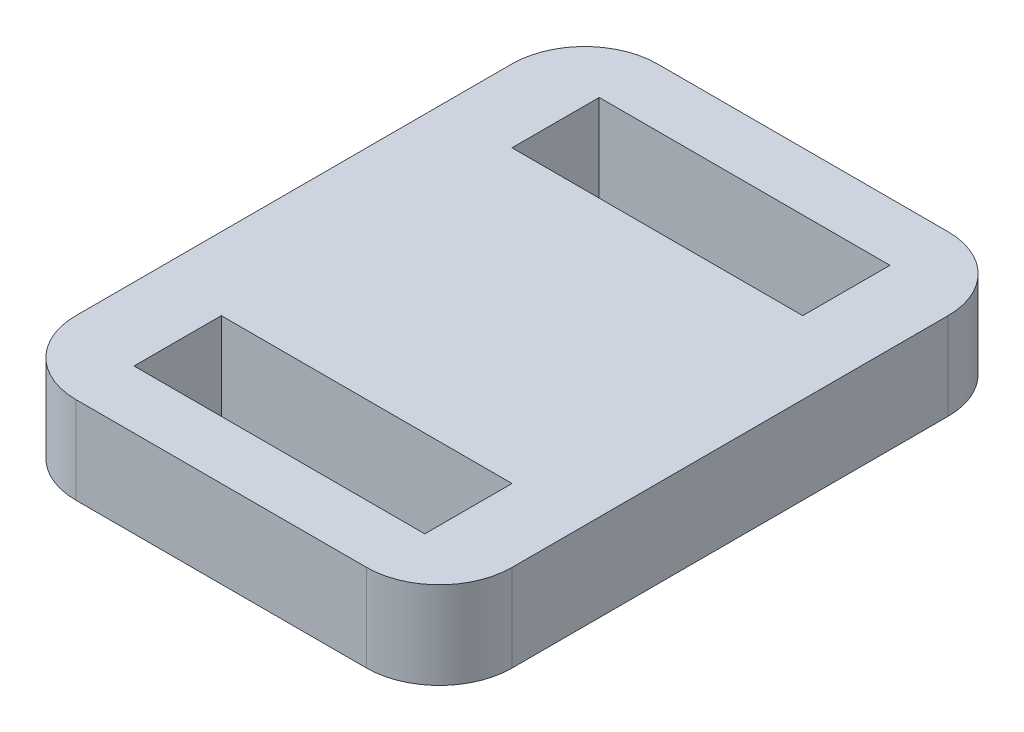
ISO-10303-21;
HEADER;
FILE_DESCRIPTION(('STEP AP214'),'2;1');
FILE_NAME('part.step','',(''),(''),'','','');
FILE_SCHEMA(('AUTOMOTIVE_DESIGN { 1 0 10303 214 1 1 1 1 }'));
ENDSEC;
DATA;
#1=APPLICATION_CONTEXT('core data for automotive mechanical design processes');
#2=APPLICATION_PROTOCOL_DEFINITION('international standard','automotive_design',2000,#1);
#3=PRODUCT_CONTEXT('',#1,'mechanical');
#4=PRODUCT('Part','Part','',(#3));
#5=PRODUCT_RELATED_PRODUCT_CATEGORY('part','',(#4));
#6=PRODUCT_DEFINITION_FORMATION('','',#4);
#7=PRODUCT_DEFINITION_CONTEXT('part definition',#1,'design');
#8=PRODUCT_DEFINITION('design','',#6,#7);
#9=PRODUCT_DEFINITION_SHAPE('','',#8);
#10=(LENGTH_UNIT() NAMED_UNIT(*) SI_UNIT(.MILLI.,.METRE.));
#11=(NAMED_UNIT(*) PLANE_ANGLE_UNIT() SI_UNIT($,.RADIAN.));
#12=(NAMED_UNIT(*) SI_UNIT($,.STERADIAN.) SOLID_ANGLE_UNIT());
#13=UNCERTAINTY_MEASURE_WITH_UNIT(LENGTH_MEASURE(1.E-05),#10,'distance_accuracy_value','');
#14=(GEOMETRIC_REPRESENTATION_CONTEXT(3) GLOBAL_UNCERTAINTY_ASSIGNED_CONTEXT((#13)) GLOBAL_UNIT_ASSIGNED_CONTEXT((#10,
#11,#12)) REPRESENTATION_CONTEXT('',''));
#15=CARTESIAN_POINT('',(0.,0.,0.));
#16=DIRECTION('',(0.,0.,1.));
#17=DIRECTION('',(1.,0.,0.));
#18=AXIS2_PLACEMENT_3D('',#15,#16,#17);
#19=CARTESIAN_POINT('',(10.,6.,2.));
#20=DIRECTION('',(0.,-1.,0.));
#21=DIRECTION('',(0.,0.,-1.));
#22=AXIS2_PLACEMENT_3D('',#19,#20,#21);
#23=PLANE('',#22);
#24=DIRECTION('',(0.,0.,-1.));
#25=VECTOR('',#24,1.);
#26=CARTESIAN_POINT('',(10.,6.,-3.));
#27=LINE('',#26,#25);
#28=CARTESIAN_POINT('',(10.,6.,3.));
#29=VERTEX_POINT('',#28);
#30=CARTESIAN_POINT('',(10.,6.,-3.));
#31=VERTEX_POINT('',#30);
#32=EDGE_CURVE('E182',#29,#31,#27,.T.);
#33=ORIENTED_EDGE('',*,*,#32,.F.);
#34=DIRECTION('',(1.,0.,0.));
#35=VECTOR('',#34,1.);
#36=CARTESIAN_POINT('',(-10.,6.,3.));
#37=LINE('',#36,#35);
#38=CARTESIAN_POINT('',(-10.,6.,3.));
#39=VERTEX_POINT('',#38);
#40=EDGE_CURVE('E190',#39,#29,#37,.T.);
#41=ORIENTED_EDGE('',*,*,#40,.F.);
#42=DIRECTION('',(0.,0.,1.));
#43=VECTOR('',#42,1.);
#44=CARTESIAN_POINT('',(-10.,6.,-3.));
#45=LINE('',#44,#43);
#46=CARTESIAN_POINT('',(-10.,6.,-3.));
#47=VERTEX_POINT('',#46);
#48=EDGE_CURVE('E187',#47,#39,#45,.T.);
#49=ORIENTED_EDGE('',*,*,#48,.F.);
#50=DIRECTION('',(-1.,0.,0.));
#51=VECTOR('',#50,1.);
#52=CARTESIAN_POINT('',(-10.,6.,-3.));
#53=LINE('',#52,#51);
#54=EDGE_CURVE('E184',#31,#47,#53,.T.);
#55=ORIENTED_EDGE('',*,*,#54,.F.);
#56=EDGE_LOOP('',(#33,#41,#49,#55));
#57=FACE_BOUND('',#56,.T.);
#58=CARTESIAN_POINT('',(10.,6.,2.));
#59=DIRECTION('',(0.,1.,0.));
#60=DIRECTION('',(0.,0.,-1.));
#61=AXIS2_PLACEMENT_3D('',#58,#59,#60);
#62=CIRCLE('',#61,5.);
#63=CARTESIAN_POINT('',(9.99999999999997,6.,7.));
#64=VERTEX_POINT('',#63);
#65=CARTESIAN_POINT('',(15.,6.,1.99999999999996));
#66=VERTEX_POINT('',#65);
#67=EDGE_CURVE('E213',#64,#66,#62,.T.);
#68=ORIENTED_EDGE('',*,*,#67,.T.);
#69=DIRECTION('',(0.,0.,-1.));
#70=VECTOR('',#69,1.);
#71=CARTESIAN_POINT('',(15.,6.,-28.));
#72=LINE('',#71,#70);
#73=CARTESIAN_POINT('',(15.,6.,-28.));
#74=VERTEX_POINT('',#73);
#75=EDGE_CURVE('E216',#66,#74,#72,.T.);
#76=ORIENTED_EDGE('',*,*,#75,.T.);
#77=CARTESIAN_POINT('',(10.,6.,-28.));
#78=DIRECTION('',(0.,1.,0.));
#79=DIRECTION('',(0.,0.,1.));
#80=AXIS2_PLACEMENT_3D('',#77,#78,#79);
#81=CIRCLE('',#80,5.);
#82=CARTESIAN_POINT('',(9.99999999999996,6.,-33.));
#83=VERTEX_POINT('',#82);
#84=EDGE_CURVE('E219',#74,#83,#81,.T.);
#85=ORIENTED_EDGE('',*,*,#84,.T.);
#86=DIRECTION('',(-1.,0.,0.));
#87=VECTOR('',#86,1.);
#88=CARTESIAN_POINT('',(-9.99999999999997,6.,-33.));
#89=LINE('',#88,#87);
#90=CARTESIAN_POINT('',(-9.99999999999997,6.,-33.));
#91=VERTEX_POINT('',#90);
#92=EDGE_CURVE('E221',#83,#91,#89,.T.);
#93=ORIENTED_EDGE('',*,*,#92,.T.);
#94=CARTESIAN_POINT('',(-10.,6.,-28.));
#95=DIRECTION('',(0.,1.,0.));
#96=DIRECTION('',(0.,0.,1.));
#97=AXIS2_PLACEMENT_3D('',#94,#95,#96);
#98=CIRCLE('',#97,5.);
#99=CARTESIAN_POINT('',(-15.,6.,-28.));
#100=VERTEX_POINT('',#99);
#101=EDGE_CURVE('E223',#91,#100,#98,.T.);
#102=ORIENTED_EDGE('',*,*,#101,.T.);
#103=DIRECTION('',(0.,0.,1.));
#104=VECTOR('',#103,1.);
#105=CARTESIAN_POINT('',(-15.,6.,-28.));
#106=LINE('',#105,#104);
#107=CARTESIAN_POINT('',(-15.,6.,1.99999999999996));
#108=VERTEX_POINT('',#107);
#109=EDGE_CURVE('E225',#100,#108,#106,.T.);
#110=ORIENTED_EDGE('',*,*,#109,.T.);
#111=CARTESIAN_POINT('',(-10.,6.,2.));
#112=DIRECTION('',(0.,1.,0.));
#113=DIRECTION('',(0.,0.,-1.));
#114=AXIS2_PLACEMENT_3D('',#111,#112,#113);
#115=CIRCLE('',#114,5.);
#116=CARTESIAN_POINT('',(-9.99999999999996,6.,7.));
#117=VERTEX_POINT('',#116);
#118=EDGE_CURVE('E227',#108,#117,#115,.T.);
#119=ORIENTED_EDGE('',*,*,#118,.T.);
#120=DIRECTION('',(1.,0.,0.));
#121=VECTOR('',#120,1.);
#122=CARTESIAN_POINT('',(-9.99999999999996,6.,7.));
#123=LINE('',#122,#121);
#124=EDGE_CURVE('E229',#117,#64,#123,.T.);
#125=ORIENTED_EDGE('',*,*,#124,.T.);
#126=EDGE_LOOP('',(#68,#76,#85,#93,#102,#110,#119,#125));
#127=FACE_BOUND('',#126,.T.);
#128=DIRECTION('',(0.,0.,-1.));
#129=VECTOR('',#128,1.);
#130=CARTESIAN_POINT('',(10.,6.,-29.));
#131=LINE('',#130,#129);
#132=CARTESIAN_POINT('',(10.,6.,-23.));
#133=VERTEX_POINT('',#132);
#134=CARTESIAN_POINT('',(10.,6.,-29.));
#135=VERTEX_POINT('',#134);
#136=EDGE_CURVE('E146',#133,#135,#131,.T.);
#137=ORIENTED_EDGE('',*,*,#136,.F.);
#138=DIRECTION('',(1.,0.,0.));
#139=VECTOR('',#138,1.);
#140=CARTESIAN_POINT('',(-10.,6.,-23.));
#141=LINE('',#140,#139);
#142=CARTESIAN_POINT('',(-9.99999999999999,6.,-23.));
#143=VERTEX_POINT('',#142);
#144=EDGE_CURVE('E168',#143,#133,#141,.T.);
#145=ORIENTED_EDGE('',*,*,#144,.F.);
#146=DIRECTION('',(0.,0.,1.));
#147=VECTOR('',#146,1.);
#148=CARTESIAN_POINT('',(-10.,6.,-29.));
#149=LINE('',#148,#147);
#150=CARTESIAN_POINT('',(-10.,6.,-29.));
#151=VERTEX_POINT('',#150);
#152=EDGE_CURVE('E166',#151,#143,#149,.T.);
#153=ORIENTED_EDGE('',*,*,#152,.F.);
#154=DIRECTION('',(-1.,0.,0.));
#155=VECTOR('',#154,1.);
#156=CARTESIAN_POINT('',(-10.,6.,-29.));
#157=LINE('',#156,#155);
#158=EDGE_CURVE('E154',#135,#151,#157,.T.);
#159=ORIENTED_EDGE('',*,*,#158,.F.);
#160=EDGE_LOOP('',(#137,#145,#153,#159));
#161=FACE_BOUND('',#160,.T.);
#162=ADVANCED_FACE('F33',(#57,#127,#161),#23,.F.);
#163=CARTESIAN_POINT('',(10.,0.,2.));
#164=DIRECTION('',(0.,-1.,0.));
#165=DIRECTION('',(0.,0.,-1.));
#166=AXIS2_PLACEMENT_3D('',#163,#164,#165);
#167=PLANE('',#166);
#168=CARTESIAN_POINT('',(10.,0.,2.));
#169=DIRECTION('',(0.,1.,0.));
#170=DIRECTION('',(0.,0.,-1.));
#171=AXIS2_PLACEMENT_3D('',#168,#169,#170);
#172=CIRCLE('',#171,5.);
#173=CARTESIAN_POINT('',(9.99999999999997,0.,7.));
#174=VERTEX_POINT('',#173);
#175=CARTESIAN_POINT('',(15.,0.,1.99999999999996));
#176=VERTEX_POINT('',#175);
#177=EDGE_CURVE('E212',#174,#176,#172,.T.);
#178=ORIENTED_EDGE('',*,*,#177,.F.);
#179=DIRECTION('',(1.,0.,0.));
#180=VECTOR('',#179,1.);
#181=CARTESIAN_POINT('',(-9.99999999999996,0.,7.));
#182=LINE('',#181,#180);
#183=CARTESIAN_POINT('',(-9.99999999999996,0.,7.));
#184=VERTEX_POINT('',#183);
#185=EDGE_CURVE('E217',#184,#174,#182,.T.);
#186=ORIENTED_EDGE('',*,*,#185,.F.);
#187=CARTESIAN_POINT('',(-10.,0.,2.));
#188=DIRECTION('',(0.,1.,0.));
#189=DIRECTION('',(0.,0.,-1.));
#190=AXIS2_PLACEMENT_3D('',#187,#188,#189);
#191=CIRCLE('',#190,5.);
#192=CARTESIAN_POINT('',(-15.,0.,1.99999999999996));
#193=VERTEX_POINT('',#192);
#194=EDGE_CURVE('E244',#193,#184,#191,.T.);
#195=ORIENTED_EDGE('',*,*,#194,.F.);
#196=DIRECTION('',(0.,0.,1.));
#197=VECTOR('',#196,1.);
#198=CARTESIAN_POINT('',(-15.,0.,-28.));
#199=LINE('',#198,#197);
#200=CARTESIAN_POINT('',(-15.,0.,-28.));
#201=VERTEX_POINT('',#200);
#202=EDGE_CURVE('E242',#201,#193,#199,.T.);
#203=ORIENTED_EDGE('',*,*,#202,.F.);
#204=CARTESIAN_POINT('',(-10.,0.,-28.));
#205=DIRECTION('',(0.,1.,0.));
#206=DIRECTION('',(0.,0.,1.));
#207=AXIS2_PLACEMENT_3D('',#204,#205,#206);
#208=CIRCLE('',#207,5.);
#209=CARTESIAN_POINT('',(-9.99999999999997,0.,-33.));
#210=VERTEX_POINT('',#209);
#211=EDGE_CURVE('E240',#210,#201,#208,.T.);
#212=ORIENTED_EDGE('',*,*,#211,.F.);
#213=DIRECTION('',(-1.,0.,0.));
#214=VECTOR('',#213,1.);
#215=CARTESIAN_POINT('',(-9.99999999999997,0.,-33.));
#216=LINE('',#215,#214);
#217=CARTESIAN_POINT('',(9.99999999999996,0.,-33.));
#218=VERTEX_POINT('',#217);
#219=EDGE_CURVE('E238',#218,#210,#216,.T.);
#220=ORIENTED_EDGE('',*,*,#219,.F.);
#221=CARTESIAN_POINT('',(10.,0.,-28.));
#222=DIRECTION('',(0.,1.,0.));
#223=DIRECTION('',(0.,0.,1.));
#224=AXIS2_PLACEMENT_3D('',#221,#222,#223);
#225=CIRCLE('',#224,5.);
#226=CARTESIAN_POINT('',(15.,0.,-28.));
#227=VERTEX_POINT('',#226);
#228=EDGE_CURVE('E236',#227,#218,#225,.T.);
#229=ORIENTED_EDGE('',*,*,#228,.F.);
#230=DIRECTION('',(0.,0.,-1.));
#231=VECTOR('',#230,1.);
#232=CARTESIAN_POINT('',(15.,0.,-28.));
#233=LINE('',#232,#231);
#234=EDGE_CURVE('E234',#176,#227,#233,.T.);
#235=ORIENTED_EDGE('',*,*,#234,.F.);
#236=EDGE_LOOP('',(#178,#186,#195,#203,#212,#220,#229,#235));
#237=FACE_BOUND('',#236,.T.);
#238=DIRECTION('',(1.,0.,0.));
#239=VECTOR('',#238,1.);
#240=CARTESIAN_POINT('',(-10.,0.,3.));
#241=LINE('',#240,#239);
#242=CARTESIAN_POINT('',(-10.,0.,3.));
#243=VERTEX_POINT('',#242);
#244=CARTESIAN_POINT('',(10.,0.,3.));
#245=VERTEX_POINT('',#244);
#246=EDGE_CURVE('E185',#243,#245,#241,.T.);
#247=ORIENTED_EDGE('',*,*,#246,.T.);
#248=DIRECTION('',(0.,0.,-1.));
#249=VECTOR('',#248,1.);
#250=CARTESIAN_POINT('',(10.,0.,-3.));
#251=LINE('',#250,#249);
#252=CARTESIAN_POINT('',(10.,0.,-3.));
#253=VERTEX_POINT('',#252);
#254=EDGE_CURVE('E162',#245,#253,#251,.T.);
#255=ORIENTED_EDGE('',*,*,#254,.T.);
#256=DIRECTION('',(-1.,0.,0.));
#257=VECTOR('',#256,1.);
#258=CARTESIAN_POINT('',(-10.,0.,-3.));
#259=LINE('',#258,#257);
#260=CARTESIAN_POINT('',(-10.,0.,-3.));
#261=VERTEX_POINT('',#260);
#262=EDGE_CURVE('E195',#253,#261,#259,.T.);
#263=ORIENTED_EDGE('',*,*,#262,.T.);
#264=DIRECTION('',(0.,0.,1.));
#265=VECTOR('',#264,1.);
#266=CARTESIAN_POINT('',(-10.,0.,-3.));
#267=LINE('',#266,#265);
#268=EDGE_CURVE('E198',#261,#243,#267,.T.);
#269=ORIENTED_EDGE('',*,*,#268,.T.);
#270=EDGE_LOOP('',(#247,#255,#263,#269));
#271=FACE_BOUND('',#270,.T.);
#272=DIRECTION('',(1.,0.,0.));
#273=VECTOR('',#272,1.);
#274=CARTESIAN_POINT('',(-10.,0.,-23.));
#275=LINE('',#274,#273);
#276=CARTESIAN_POINT('',(-10.,0.,-23.));
#277=VERTEX_POINT('',#276);
#278=CARTESIAN_POINT('',(10.,0.,-23.));
#279=VERTEX_POINT('',#278);
#280=EDGE_CURVE('E155',#277,#279,#275,.T.);
#281=ORIENTED_EDGE('',*,*,#280,.T.);
#282=DIRECTION('',(0.,0.,-1.));
#283=VECTOR('',#282,1.);
#284=CARTESIAN_POINT('',(10.,0.,-29.));
#285=LINE('',#284,#283);
#286=CARTESIAN_POINT('',(10.,0.,-29.));
#287=VERTEX_POINT('',#286);
#288=EDGE_CURVE('E56',#279,#287,#285,.T.);
#289=ORIENTED_EDGE('',*,*,#288,.T.);
#290=DIRECTION('',(-1.,0.,0.));
#291=VECTOR('',#290,1.);
#292=CARTESIAN_POINT('',(-10.,0.,-29.));
#293=LINE('',#292,#291);
#294=CARTESIAN_POINT('',(-10.,0.,-29.));
#295=VERTEX_POINT('',#294);
#296=EDGE_CURVE('E161',#287,#295,#293,.T.);
#297=ORIENTED_EDGE('',*,*,#296,.T.);
#298=DIRECTION('',(0.,0.,1.));
#299=VECTOR('',#298,1.);
#300=CARTESIAN_POINT('',(-10.,0.,-29.));
#301=LINE('',#300,#299);
#302=EDGE_CURVE('E174',#295,#277,#301,.T.);
#303=ORIENTED_EDGE('',*,*,#302,.T.);
#304=EDGE_LOOP('',(#281,#289,#297,#303));
#305=FACE_BOUND('',#304,.T.);
#306=ADVANCED_FACE('F274',(#237,#271,#305),#167,.T.);
#307=CARTESIAN_POINT('',(10.,6.,2.));
#308=DIRECTION('',(0.,-1.,0.));
#309=DIRECTION('',(0.,0.,-1.));
#310=AXIS2_PLACEMENT_3D('',#307,#308,#309);
#311=CYLINDRICAL_SURFACE('',#310,5.);
#312=ORIENTED_EDGE('',*,*,#177,.T.);
#313=DIRECTION('',(0.,-1.,0.));
#314=VECTOR('',#313,1.);
#315=CARTESIAN_POINT('',(15.,6.,1.99999999999996));
#316=LINE('',#315,#314);
#317=EDGE_CURVE('E11',#66,#176,#316,.T.);
#318=ORIENTED_EDGE('',*,*,#317,.F.);
#319=ORIENTED_EDGE('',*,*,#67,.F.);
#320=DIRECTION('',(0.,-1.,0.));
#321=VECTOR('',#320,1.);
#322=CARTESIAN_POINT('',(9.99999999999997,6.,7.));
#323=LINE('',#322,#321);
#324=EDGE_CURVE('E231',#64,#174,#323,.T.);
#325=ORIENTED_EDGE('',*,*,#324,.T.);
#326=EDGE_LOOP('',(#312,#318,#319,#325));
#327=FACE_BOUND('',#326,.T.);
#328=ADVANCED_FACE('F35',(#327),#311,.T.);
#329=CARTESIAN_POINT('',(15.,6.,-28.));
#330=DIRECTION('',(-1.,0.,0.));
#331=DIRECTION('',(0.,0.,1.));
#332=AXIS2_PLACEMENT_3D('',#329,#330,#331);
#333=PLANE('',#332);
#334=ORIENTED_EDGE('',*,*,#234,.T.);
#335=DIRECTION('',(0.,-1.,0.));
#336=VECTOR('',#335,1.);
#337=CARTESIAN_POINT('',(15.,6.,-28.));
#338=LINE('',#337,#336);
#339=EDGE_CURVE('E41',#74,#227,#338,.T.);
#340=ORIENTED_EDGE('',*,*,#339,.F.);
#341=ORIENTED_EDGE('',*,*,#75,.F.);
#342=ORIENTED_EDGE('',*,*,#317,.T.);
#343=EDGE_LOOP('',(#334,#340,#341,#342));
#344=FACE_BOUND('',#343,.T.);
#345=ADVANCED_FACE('F291',(#344),#333,.F.);
#346=CARTESIAN_POINT('',(10.,6.,-28.));
#347=DIRECTION('',(0.,-1.,0.));
#348=DIRECTION('',(0.,0.,-1.));
#349=AXIS2_PLACEMENT_3D('',#346,#347,#348);
#350=CYLINDRICAL_SURFACE('',#349,5.);
#351=ORIENTED_EDGE('',*,*,#228,.T.);
#352=DIRECTION('',(0.,-1.,0.));
#353=VECTOR('',#352,1.);
#354=CARTESIAN_POINT('',(9.99999999999996,6.,-33.));
#355=LINE('',#354,#353);
#356=EDGE_CURVE('E261',#83,#218,#355,.T.);
#357=ORIENTED_EDGE('',*,*,#356,.F.);
#358=ORIENTED_EDGE('',*,*,#84,.F.);
#359=ORIENTED_EDGE('',*,*,#339,.T.);
#360=EDGE_LOOP('',(#351,#357,#358,#359));
#361=FACE_BOUND('',#360,.T.);
#362=ADVANCED_FACE('F268',(#361),#350,.T.);
#363=CARTESIAN_POINT('',(-9.99999999999997,6.,-33.));
#364=DIRECTION('',(0.,0.,1.));
#365=DIRECTION('',(1.,0.,0.));
#366=AXIS2_PLACEMENT_3D('',#363,#364,#365);
#367=PLANE('',#366);
#368=ORIENTED_EDGE('',*,*,#219,.T.);
#369=DIRECTION('',(0.,-1.,0.));
#370=VECTOR('',#369,1.);
#371=CARTESIAN_POINT('',(-9.99999999999997,6.,-33.));
#372=LINE('',#371,#370);
#373=EDGE_CURVE('E258',#91,#210,#372,.T.);
#374=ORIENTED_EDGE('',*,*,#373,.F.);
#375=ORIENTED_EDGE('',*,*,#92,.F.);
#376=ORIENTED_EDGE('',*,*,#356,.T.);
#377=EDGE_LOOP('',(#368,#374,#375,#376));
#378=FACE_BOUND('',#377,.T.);
#379=ADVANCED_FACE('F280',(#378),#367,.F.);
#380=CARTESIAN_POINT('',(-10.,6.,-28.));
#381=DIRECTION('',(0.,-1.,0.));
#382=DIRECTION('',(0.,0.,-1.));
#383=AXIS2_PLACEMENT_3D('',#380,#381,#382);
#384=CYLINDRICAL_SURFACE('',#383,5.);
#385=ORIENTED_EDGE('',*,*,#211,.T.);
#386=DIRECTION('',(0.,-1.,0.));
#387=VECTOR('',#386,1.);
#388=CARTESIAN_POINT('',(-15.,6.,-28.));
#389=LINE('',#388,#387);
#390=EDGE_CURVE('E255',#100,#201,#389,.T.);
#391=ORIENTED_EDGE('',*,*,#390,.F.);
#392=ORIENTED_EDGE('',*,*,#101,.F.);
#393=ORIENTED_EDGE('',*,*,#373,.T.);
#394=EDGE_LOOP('',(#385,#391,#392,#393));
#395=FACE_BOUND('',#394,.T.);
#396=ADVANCED_FACE('F284',(#395),#384,.T.);
#397=CARTESIAN_POINT('',(-15.,6.,-28.));
#398=DIRECTION('',(1.,0.,0.));
#399=DIRECTION('',(0.,0.,-1.));
#400=AXIS2_PLACEMENT_3D('',#397,#398,#399);
#401=PLANE('',#400);
#402=ORIENTED_EDGE('',*,*,#202,.T.);
#403=DIRECTION('',(0.,-1.,0.));
#404=VECTOR('',#403,1.);
#405=CARTESIAN_POINT('',(-15.,6.,1.99999999999996));
#406=LINE('',#405,#404);
#407=EDGE_CURVE('E252',#108,#193,#406,.T.);
#408=ORIENTED_EDGE('',*,*,#407,.F.);
#409=ORIENTED_EDGE('',*,*,#109,.F.);
#410=ORIENTED_EDGE('',*,*,#390,.T.);
#411=EDGE_LOOP('',(#402,#408,#409,#410));
#412=FACE_BOUND('',#411,.T.);
#413=ADVANCED_FACE('F304',(#412),#401,.F.);
#414=CARTESIAN_POINT('',(-10.,6.,2.));
#415=DIRECTION('',(0.,-1.,0.));
#416=DIRECTION('',(0.,0.,-1.));
#417=AXIS2_PLACEMENT_3D('',#414,#415,#416);
#418=CYLINDRICAL_SURFACE('',#417,5.);
#419=ORIENTED_EDGE('',*,*,#194,.T.);
#420=DIRECTION('',(0.,-1.,0.));
#421=VECTOR('',#420,1.);
#422=CARTESIAN_POINT('',(-9.99999999999996,6.,7.));
#423=LINE('',#422,#421);
#424=EDGE_CURVE('E249',#117,#184,#423,.T.);
#425=ORIENTED_EDGE('',*,*,#424,.F.);
#426=ORIENTED_EDGE('',*,*,#118,.F.);
#427=ORIENTED_EDGE('',*,*,#407,.T.);
#428=EDGE_LOOP('',(#419,#425,#426,#427));
#429=FACE_BOUND('',#428,.T.);
#430=ADVANCED_FACE('F302',(#429),#418,.T.);
#431=CARTESIAN_POINT('',(-9.99999999999996,6.,7.));
#432=DIRECTION('',(0.,0.,-1.));
#433=DIRECTION('',(-1.,0.,0.));
#434=AXIS2_PLACEMENT_3D('',#431,#432,#433);
#435=PLANE('',#434);
#436=ORIENTED_EDGE('',*,*,#185,.T.);
#437=ORIENTED_EDGE('',*,*,#324,.F.);
#438=ORIENTED_EDGE('',*,*,#124,.F.);
#439=ORIENTED_EDGE('',*,*,#424,.T.);
#440=EDGE_LOOP('',(#436,#437,#438,#439));
#441=FACE_BOUND('',#440,.T.);
#442=ADVANCED_FACE('F297',(#441),#435,.F.);
#443=CARTESIAN_POINT('',(10.,6.,-3.));
#444=DIRECTION('',(-1.,0.,0.));
#445=DIRECTION('',(0.,0.,1.));
#446=AXIS2_PLACEMENT_3D('',#443,#444,#445);
#447=PLANE('',#446);
#448=ORIENTED_EDGE('',*,*,#254,.F.);
#449=DIRECTION('',(0.,-1.,0.));
#450=VECTOR('',#449,1.);
#451=CARTESIAN_POINT('',(10.,6.,3.));
#452=LINE('',#451,#450);
#453=EDGE_CURVE('E192',#29,#245,#452,.T.);
#454=ORIENTED_EDGE('',*,*,#453,.F.);
#455=ORIENTED_EDGE('',*,*,#32,.T.);
#456=DIRECTION('',(0.,-1.,0.));
#457=VECTOR('',#456,1.);
#458=CARTESIAN_POINT('',(10.,6.,-3.));
#459=LINE('',#458,#457);
#460=EDGE_CURVE('E209',#31,#253,#459,.T.);
#461=ORIENTED_EDGE('',*,*,#460,.T.);
#462=EDGE_LOOP('',(#448,#454,#455,#461));
#463=FACE_BOUND('',#462,.T.);
#464=ADVANCED_FACE('F322',(#463),#447,.T.);
#465=CARTESIAN_POINT('',(-10.,6.,-3.));
#466=DIRECTION('',(0.,0.,1.));
#467=DIRECTION('',(1.,0.,0.));
#468=AXIS2_PLACEMENT_3D('',#465,#466,#467);
#469=PLANE('',#468);
#470=ORIENTED_EDGE('',*,*,#262,.F.);
#471=ORIENTED_EDGE('',*,*,#460,.F.);
#472=ORIENTED_EDGE('',*,*,#54,.T.);
#473=DIRECTION('',(0.,-1.,0.));
#474=VECTOR('',#473,1.);
#475=CARTESIAN_POINT('',(-10.,6.,-3.));
#476=LINE('',#475,#474);
#477=EDGE_CURVE('E207',#47,#261,#476,.T.);
#478=ORIENTED_EDGE('',*,*,#477,.T.);
#479=EDGE_LOOP('',(#470,#471,#472,#478));
#480=FACE_BOUND('',#479,.T.);
#481=ADVANCED_FACE('F329',(#480),#469,.T.);
#482=CARTESIAN_POINT('',(-10.,6.,-3.));
#483=DIRECTION('',(1.,0.,0.));
#484=DIRECTION('',(0.,0.,-1.));
#485=AXIS2_PLACEMENT_3D('',#482,#483,#484);
#486=PLANE('',#485);
#487=ORIENTED_EDGE('',*,*,#268,.F.);
#488=ORIENTED_EDGE('',*,*,#477,.F.);
#489=ORIENTED_EDGE('',*,*,#48,.T.);
#490=DIRECTION('',(0.,-1.,0.));
#491=VECTOR('',#490,1.);
#492=CARTESIAN_POINT('',(-10.,6.,3.));
#493=LINE('',#492,#491);
#494=EDGE_CURVE('E205',#39,#243,#493,.T.);
#495=ORIENTED_EDGE('',*,*,#494,.T.);
#496=EDGE_LOOP('',(#487,#488,#489,#495));
#497=FACE_BOUND('',#496,.T.);
#498=ADVANCED_FACE('F334',(#497),#486,.T.);
#499=CARTESIAN_POINT('',(-10.,6.,3.));
#500=DIRECTION('',(0.,0.,-1.));
#501=DIRECTION('',(-1.,0.,0.));
#502=AXIS2_PLACEMENT_3D('',#499,#500,#501);
#503=PLANE('',#502);
#504=ORIENTED_EDGE('',*,*,#246,.F.);
#505=ORIENTED_EDGE('',*,*,#494,.F.);
#506=ORIENTED_EDGE('',*,*,#40,.T.);
#507=ORIENTED_EDGE('',*,*,#453,.T.);
#508=EDGE_LOOP('',(#504,#505,#506,#507));
#509=FACE_BOUND('',#508,.T.);
#510=ADVANCED_FACE('F340',(#509),#503,.T.);
#511=CARTESIAN_POINT('',(10.,6.,-29.));
#512=DIRECTION('',(-1.,0.,0.));
#513=DIRECTION('',(0.,0.,1.));
#514=AXIS2_PLACEMENT_3D('',#511,#512,#513);
#515=PLANE('',#514);
#516=ORIENTED_EDGE('',*,*,#288,.F.);
#517=DIRECTION('',(0.,-1.,0.));
#518=VECTOR('',#517,1.);
#519=CARTESIAN_POINT('',(10.,6.,-23.));
#520=LINE('',#519,#518);
#521=EDGE_CURVE('E150',#133,#279,#520,.T.);
#522=ORIENTED_EDGE('',*,*,#521,.F.);
#523=ORIENTED_EDGE('',*,*,#136,.T.);
#524=DIRECTION('',(0.,-1.,0.));
#525=VECTOR('',#524,1.);
#526=CARTESIAN_POINT('',(10.,6.,-29.));
#527=LINE('',#526,#525);
#528=EDGE_CURVE('E149',#135,#287,#527,.T.);
#529=ORIENTED_EDGE('',*,*,#528,.T.);
#530=EDGE_LOOP('',(#516,#522,#523,#529));
#531=FACE_BOUND('',#530,.T.);
#532=ADVANCED_FACE('F148',(#531),#515,.T.);
#533=CARTESIAN_POINT('',(-10.,6.,-29.));
#534=DIRECTION('',(0.,0.,1.));
#535=DIRECTION('',(1.,0.,0.));
#536=AXIS2_PLACEMENT_3D('',#533,#534,#535);
#537=PLANE('',#536);
#538=ORIENTED_EDGE('',*,*,#296,.F.);
#539=ORIENTED_EDGE('',*,*,#528,.F.);
#540=ORIENTED_EDGE('',*,*,#158,.T.);
#541=DIRECTION('',(0.,-1.,0.));
#542=VECTOR('',#541,1.);
#543=CARTESIAN_POINT('',(-10.,6.,-29.));
#544=LINE('',#543,#542);
#545=EDGE_CURVE('E163',#151,#295,#544,.T.);
#546=ORIENTED_EDGE('',*,*,#545,.T.);
#547=EDGE_LOOP('',(#538,#539,#540,#546));
#548=FACE_BOUND('',#547,.T.);
#549=ADVANCED_FACE('F158',(#548),#537,.T.);
#550=CARTESIAN_POINT('',(-10.,6.,-29.));
#551=DIRECTION('',(1.,0.,0.));
#552=DIRECTION('',(0.,0.,-1.));
#553=AXIS2_PLACEMENT_3D('',#550,#551,#552);
#554=PLANE('',#553);
#555=ORIENTED_EDGE('',*,*,#302,.F.);
#556=ORIENTED_EDGE('',*,*,#545,.F.);
#557=ORIENTED_EDGE('',*,*,#152,.T.);
#558=DIRECTION('',(0.,-1.,0.));
#559=VECTOR('',#558,1.);
#560=CARTESIAN_POINT('',(-10.,6.,-23.));
#561=LINE('',#560,#559);
#562=EDGE_CURVE('E48',#143,#277,#561,.T.);
#563=ORIENTED_EDGE('',*,*,#562,.T.);
#564=EDGE_LOOP('',(#555,#556,#557,#563));
#565=FACE_BOUND('',#564,.T.);
#566=ADVANCED_FACE('F359',(#565),#554,.T.);
#567=CARTESIAN_POINT('',(-10.,6.,-23.));
#568=DIRECTION('',(0.,0.,-1.));
#569=DIRECTION('',(-1.,0.,0.));
#570=AXIS2_PLACEMENT_3D('',#567,#568,#569);
#571=PLANE('',#570);
#572=ORIENTED_EDGE('',*,*,#280,.F.);
#573=ORIENTED_EDGE('',*,*,#562,.F.);
#574=ORIENTED_EDGE('',*,*,#144,.T.);
#575=ORIENTED_EDGE('',*,*,#521,.T.);
#576=EDGE_LOOP('',(#572,#573,#574,#575));
#577=FACE_BOUND('',#576,.T.);
#578=ADVANCED_FACE('F362',(#577),#571,.T.);
#579=CLOSED_SHELL('',(#162,#306,#328,#345,#362,#379,#396,#413,#430,#442,#464,#481,#498,#510,
#532,#549,#566,#578));
#580=MANIFOLD_SOLID_BREP('B2',#579);
#581=ADVANCED_BREP_SHAPE_REPRESENTATION('',(#18,#580),#14);
#582=SHAPE_DEFINITION_REPRESENTATION(#9,#581);
ENDSEC;
END-ISO-10303-21;
